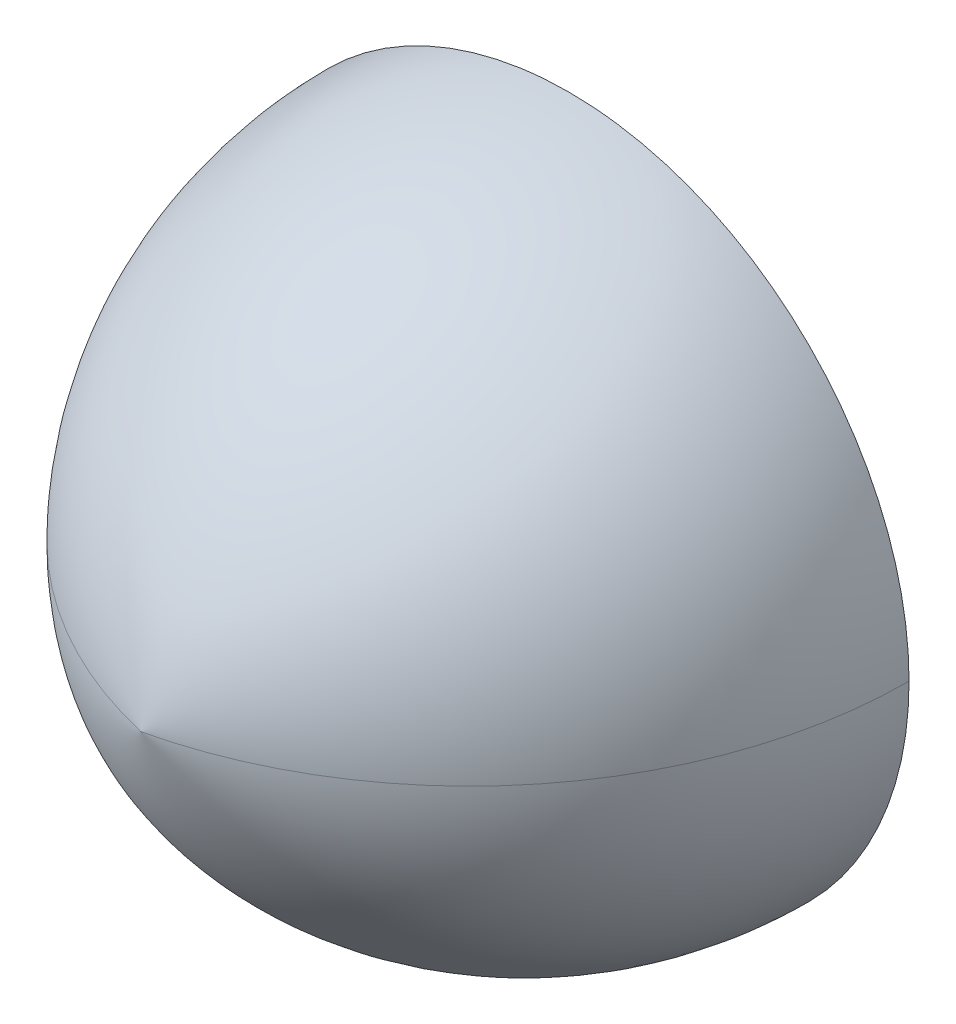
ISO-10303-21;
HEADER;
FILE_DESCRIPTION(('STEP AP214'),'2;1');
FILE_NAME('part.step','',(''),(''),'','','');
FILE_SCHEMA(('AUTOMOTIVE_DESIGN { 1 0 10303 214 1 1 1 1 }'));
ENDSEC;
DATA;
#1=APPLICATION_CONTEXT('core data for automotive mechanical design processes');
#2=APPLICATION_PROTOCOL_DEFINITION('international standard','automotive_design',2000,#1);
#3=PRODUCT_CONTEXT('',#1,'mechanical');
#4=PRODUCT('Part','Part','',(#3));
#5=PRODUCT_RELATED_PRODUCT_CATEGORY('part','',(#4));
#6=PRODUCT_DEFINITION_FORMATION('','',#4);
#7=PRODUCT_DEFINITION_CONTEXT('part definition',#1,'design');
#8=PRODUCT_DEFINITION('design','',#6,#7);
#9=PRODUCT_DEFINITION_SHAPE('','',#8);
#10=(LENGTH_UNIT() NAMED_UNIT(*) SI_UNIT(.MILLI.,.METRE.));
#11=(NAMED_UNIT(*) PLANE_ANGLE_UNIT() SI_UNIT($,.RADIAN.));
#12=(NAMED_UNIT(*) SI_UNIT($,.STERADIAN.) SOLID_ANGLE_UNIT());
#13=UNCERTAINTY_MEASURE_WITH_UNIT(LENGTH_MEASURE(1.E-05),#10,'distance_accuracy_value','');
#14=(GEOMETRIC_REPRESENTATION_CONTEXT(3) GLOBAL_UNCERTAINTY_ASSIGNED_CONTEXT((#13)) GLOBAL_UNIT_ASSIGNED_CONTEXT((#10,
#11,#12)) REPRESENTATION_CONTEXT('',''));
#15=CARTESIAN_POINT('',(0.,0.,0.));
#16=DIRECTION('',(0.,0.,1.));
#17=DIRECTION('',(1.,0.,0.));
#18=AXIS2_PLACEMENT_3D('',#15,#16,#17);
#19=CARTESIAN_POINT('',(0.,0.,3.5));
#20=DIRECTION('',(0.,0.,-1.));
#21=DIRECTION('',(0.,-1.,0.));
#22=AXIS2_PLACEMENT_3D('',#19,#20,#21);
#23=PLANE('',#22);
#24=CARTESIAN_POINT('',(0.,0.,3.5));
#25=DIRECTION('',(0.,0.,1.));
#26=DIRECTION('',(-1.,0.,0.));
#27=AXIS2_PLACEMENT_3D('',#24,#25,#26);
#28=CIRCLE('',#27,5.75);
#29=CARTESIAN_POINT('',(-5.75,0.,3.5));
#30=VERTEX_POINT('',#29);
#31=CARTESIAN_POINT('',(5.75,0.,3.5));
#32=VERTEX_POINT('',#31);
#33=EDGE_CURVE('E11',#30,#32,#28,.T.);
#34=ORIENTED_EDGE('',*,*,#33,.T.);
#35=CARTESIAN_POINT('',(0.,0.,3.5));
#36=DIRECTION('',(0.,0.,1.));
#37=DIRECTION('',(1.,0.,0.));
#38=AXIS2_PLACEMENT_3D('',#35,#36,#37);
#39=CIRCLE('',#38,5.75);
#40=EDGE_CURVE('E136',#32,#30,#39,.T.);
#41=ORIENTED_EDGE('',*,*,#40,.T.);
#42=EDGE_LOOP('',(#34,#41));
#43=FACE_BOUND('',#42,.T.);
#44=CARTESIAN_POINT('',(0.,0.,3.5));
#45=DIRECTION('',(0.,0.,-1.));
#46=DIRECTION('',(-1.,0.,0.));
#47=AXIS2_PLACEMENT_3D('',#44,#45,#46);
#48=CIRCLE('',#47,8.4);
#49=CARTESIAN_POINT('',(-8.4,0.,3.5));
#50=VERTEX_POINT('',#49);
#51=CARTESIAN_POINT('',(8.4,0.,3.5));
#52=VERTEX_POINT('',#51);
#53=EDGE_CURVE('E128',#50,#52,#48,.T.);
#54=ORIENTED_EDGE('',*,*,#53,.T.);
#55=CARTESIAN_POINT('',(0.,0.,3.5));
#56=DIRECTION('',(0.,0.,-1.));
#57=DIRECTION('',(1.,0.,0.));
#58=AXIS2_PLACEMENT_3D('',#55,#56,#57);
#59=CIRCLE('',#58,8.4);
#60=EDGE_CURVE('E152',#52,#50,#59,.T.);
#61=ORIENTED_EDGE('',*,*,#60,.T.);
#62=EDGE_LOOP('',(#54,#61));
#63=FACE_BOUND('',#62,.T.);
#64=ADVANCED_FACE('F16',(#43,#63),#23,.T.);
#65=CARTESIAN_POINT('',(0.,0.,3.5));
#66=DIRECTION('',(0.,0.,-1.));
#67=DIRECTION('',(1.,0.,0.));
#68=AXIS2_PLACEMENT_3D('',#65,#66,#67);
#69=CYLINDRICAL_SURFACE('',#68,5.75);
#70=DIRECTION('',(0.,0.,1.));
#71=VECTOR('',#70,1.);
#72=CARTESIAN_POINT('',(5.75,0.,3.5));
#73=LINE('',#72,#71);
#74=CARTESIAN_POINT('',(5.75,0.,15.70990503957));
#75=VERTEX_POINT('',#74);
#76=EDGE_CURVE('E28',#32,#75,#73,.T.);
#77=ORIENTED_EDGE('',*,*,#76,.F.);
#78=ORIENTED_EDGE('',*,*,#33,.F.);
#79=DIRECTION('',(0.,0.,1.));
#80=VECTOR('',#79,1.);
#81=CARTESIAN_POINT('',(-5.75,0.,3.5));
#82=LINE('',#81,#80);
#83=CARTESIAN_POINT('',(-5.75,0.,15.70990503957));
#84=VERTEX_POINT('',#83);
#85=EDGE_CURVE('E133',#30,#84,#82,.T.);
#86=ORIENTED_EDGE('',*,*,#85,.T.);
#87=CARTESIAN_POINT('',(0.,0.,15.70990503957));
#88=DIRECTION('',(0.,0.,-1.));
#89=DIRECTION('',(1.,0.,0.));
#90=AXIS2_PLACEMENT_3D('',#87,#88,#89);
#91=CIRCLE('',#90,5.75);
#92=EDGE_CURVE('E145',#75,#84,#91,.T.);
#93=ORIENTED_EDGE('',*,*,#92,.F.);
#94=EDGE_LOOP('',(#77,#78,#86,#93));
#95=FACE_BOUND('',#94,.T.);
#96=ADVANCED_FACE('F206',(#95),#69,.F.);
#97=CARTESIAN_POINT('',(0.,0.,3.5));
#98=DIRECTION('',(0.,0.,-1.));
#99=DIRECTION('',(1.,0.,0.));
#100=AXIS2_PLACEMENT_3D('',#97,#98,#99);
#101=CYLINDRICAL_SURFACE('',#100,5.75);
#102=ORIENTED_EDGE('',*,*,#85,.F.);
#103=ORIENTED_EDGE('',*,*,#40,.F.);
#104=ORIENTED_EDGE('',*,*,#76,.T.);
#105=CARTESIAN_POINT('',(0.,0.,15.70990503957));
#106=DIRECTION('',(0.,0.,-1.));
#107=DIRECTION('',(-1.,0.,0.));
#108=AXIS2_PLACEMENT_3D('',#105,#106,#107);
#109=CIRCLE('',#108,5.75);
#110=EDGE_CURVE('E137',#84,#75,#109,.T.);
#111=ORIENTED_EDGE('',*,*,#110,.F.);
#112=EDGE_LOOP('',(#102,#103,#104,#111));
#113=FACE_BOUND('',#112,.T.);
#114=ADVANCED_FACE('F205',(#113),#101,.F.);
#115=CARTESIAN_POINT('',(0.,0.,18.25082749912));
#116=CARTESIAN_POINT('',(-8.878861154744,-0.5586105951421,15.99459569259));
#117=CARTESIAN_POINT('',(-14.40764551764,-0.9064522236506,8.676921688021));
#118=CARTESIAN_POINT('',(-14.16540742833,-0.8912118948655,-0.4979293520499));
#119=CARTESIAN_POINT('',(0.,0.,18.25082749912));
#120=CARTESIAN_POINT('',(-9.22262933143,4.905428105088,15.99459569259));
#121=CARTESIAN_POINT('',(-14.96547494459,7.959992618263,8.676921688021));
#122=CARTESIAN_POINT('',(-14.71385797832,7.826159966674,-0.4979293520499));
#123=CARTESIAN_POINT('',(0.,0.,18.25082749912));
#124=CARTESIAN_POINT('',(-5.47484205040699,8.896416199922,15.99459569259));
#125=CARTESIAN_POINT('',(-8.883975337892,14.43613192637,8.676921688021));
#126=CARTESIAN_POINT('',(-8.734607614436,14.19341489043,-0.4979293520499));
#127=CARTESIAN_POINT('',(0.,0.,18.25082749912));
#128=CARTESIAN_POINT('',(0.,8.89641619992199,15.99459569259));
#129=CARTESIAN_POINT('',(0.,14.43613192637,8.676921688021));
#130=CARTESIAN_POINT('',(0.,14.19341489043,-0.4979293520499));
#131=CARTESIAN_POINT('',(0.,0.,18.25082749912));
#132=CARTESIAN_POINT('',(5.47484205040699,8.896416199922,15.99459569259));
#133=CARTESIAN_POINT('',(8.883975337892,14.43613192637,8.676921688021));
#134=CARTESIAN_POINT('',(8.734607614436,14.19341489043,-0.4979293520499));
#135=CARTESIAN_POINT('',(0.,0.,18.25082749912));
#136=CARTESIAN_POINT('',(9.22262933143,4.905428105088,15.99459569259));
#137=CARTESIAN_POINT('',(14.96547494459,7.959992618263,8.676921688021));
#138=CARTESIAN_POINT('',(14.71385797832,7.826159966674,-0.4979293520499));
#139=CARTESIAN_POINT('',(0.,0.,18.25082749912));
#140=CARTESIAN_POINT('',(8.878861154744,-0.5586105951421,15.99459569259));
#141=CARTESIAN_POINT('',(14.40764551764,-0.9064522236506,8.676921688021));
#142=CARTESIAN_POINT('',(14.16540742833,-0.8912118948655,-0.4979293520499));
#143=(BOUNDED_SURFACE() B_SPLINE_SURFACE(3,3,((#115,#116,#117,#118),(#119,#120,#121,#122),(#123,
#124,#125,#126),(#127,#128,#129,#130),(#131,#132,#133,#134),(#135,#136,#137,#138),(#139,#140,
#141,#142)),.UNSPECIFIED.,.F.,.F.,.F.) B_SPLINE_SURFACE_WITH_KNOTS((4,3,4),(4,4),(0.,1.,2.),(0.,
1.),.UNSPECIFIED.) GEOMETRIC_REPRESENTATION_ITEM() RATIONAL_B_SPLINE_SURFACE(((1.333209242531,
1.138613895815,1.138613895815,1.333209242531),(1.052832766558,0.8991611967054,0.8991611967054,
1.052832766558),(1.052832766558,0.8991611967054,0.8991611967054,1.052832766558),(1.333209242531,
1.138613895815,1.138613895815,1.333209242531),(1.052832766558,0.8991611967054,0.8991611967054,
1.052832766558),(1.052832766558,0.8991611967054,0.8991611967054,1.052832766558),(1.333209242531,
1.138613895815,1.138613895815,1.333209242531))) REPRESENTATION_ITEM('') SURFACE());
#144=CARTESIAN_POINT('',(-4.628616352201,0.,0.));
#145=DIRECTION('',(0.,-1.,0.));
#146=DIRECTION('',(0.551215031315217,0.,0.834363223813325));
#147=AXIS2_PLACEMENT_3D('',#144,#145,#146);
#148=CIRCLE('',#147,18.8286163522);
#149=CARTESIAN_POINT('',(0.,0.,18.25082749912));
#150=VERTEX_POINT('',#149);
#151=EDGE_CURVE('E142',#75,#150,#148,.T.);
#152=CARTESIAN_POINT('',(4.628616352201,0.,0.));
#153=DIRECTION('',(0.,1.,0.));
#154=DIRECTION('',(-0.551215031315217,0.,0.834363223813325));
#155=AXIS2_PLACEMENT_3D('',#152,#153,#154);
#156=CIRCLE('',#155,18.8286163522);
#157=EDGE_CURVE('E127',#84,#150,#156,.T.);
#158=ORIENTED_EDGE('',*,*,#151,.T.);
#159=ORIENTED_EDGE('',*,*,#157,.F.);
#160=ORIENTED_EDGE('',*,*,#110,.T.);
#161=EDGE_LOOP('',(#158,#159,#160));
#162=FACE_BOUND('',#161,.T.);
#163=ADVANCED_FACE('F165',(#162),#143,.F.);
#164=CARTESIAN_POINT('',(0.,0.,18.25082749912));
#165=CARTESIAN_POINT('',(-8.878861154744,-0.5586105951421,15.99459569259));
#166=CARTESIAN_POINT('',(-14.40764551764,-0.9064522236506,8.676921688021));
#167=CARTESIAN_POINT('',(-14.16540742833,-0.8912118948655,-0.4979293520499));
#168=CARTESIAN_POINT('',(0.,0.,18.25082749912));
#169=CARTESIAN_POINT('',(-9.22262933143,4.905428105088,15.99459569259));
#170=CARTESIAN_POINT('',(-14.96547494459,7.959992618263,8.676921688021));
#171=CARTESIAN_POINT('',(-14.71385797832,7.826159966674,-0.4979293520499));
#172=CARTESIAN_POINT('',(0.,0.,18.25082749912));
#173=CARTESIAN_POINT('',(-5.47484205040699,8.896416199922,15.99459569259));
#174=CARTESIAN_POINT('',(-8.883975337892,14.43613192637,8.676921688021));
#175=CARTESIAN_POINT('',(-8.734607614436,14.19341489043,-0.4979293520499));
#176=CARTESIAN_POINT('',(0.,0.,18.25082749912));
#177=CARTESIAN_POINT('',(0.,8.89641619992199,15.99459569259));
#178=CARTESIAN_POINT('',(0.,14.43613192637,8.676921688021));
#179=CARTESIAN_POINT('',(0.,14.19341489043,-0.4979293520499));
#180=CARTESIAN_POINT('',(0.,0.,18.25082749912));
#181=CARTESIAN_POINT('',(5.47484205040699,8.896416199922,15.99459569259));
#182=CARTESIAN_POINT('',(8.883975337892,14.43613192637,8.676921688021));
#183=CARTESIAN_POINT('',(8.734607614436,14.19341489043,-0.4979293520499));
#184=CARTESIAN_POINT('',(0.,0.,18.25082749912));
#185=CARTESIAN_POINT('',(9.22262933143,4.905428105088,15.99459569259));
#186=CARTESIAN_POINT('',(14.96547494459,7.959992618263,8.676921688021));
#187=CARTESIAN_POINT('',(14.71385797832,7.826159966674,-0.4979293520499));
#188=CARTESIAN_POINT('',(0.,0.,18.25082749912));
#189=CARTESIAN_POINT('',(8.878861154744,-0.5586105951421,15.99459569259));
#190=CARTESIAN_POINT('',(14.40764551764,-0.9064522236506,8.676921688021));
#191=CARTESIAN_POINT('',(14.16540742833,-0.8912118948655,-0.4979293520499));
#192=(BOUNDED_SURFACE() B_SPLINE_SURFACE(3,3,((#164,#165,#166,#167),(#168,#169,#170,#171),(#172,
#173,#174,#175),(#176,#177,#178,#179),(#180,#181,#182,#183),(#184,#185,#186,#187),(#188,#189,
#190,#191)),.UNSPECIFIED.,.F.,.F.,.F.) B_SPLINE_SURFACE_WITH_KNOTS((4,3,4),(4,4),(0.,1.,2.),(0.,
1.),.UNSPECIFIED.) GEOMETRIC_REPRESENTATION_ITEM() RATIONAL_B_SPLINE_SURFACE(((1.333209242531,
1.138613895815,1.138613895815,1.333209242531),(1.052832766558,0.8991611967054,0.8991611967054,
1.052832766558),(1.052832766558,0.8991611967054,0.8991611967054,1.052832766558),(1.333209242531,
1.138613895815,1.138613895815,1.333209242531),(1.052832766558,0.8991611967054,0.8991611967054,
1.052832766558),(1.052832766558,0.8991611967054,0.8991611967054,1.052832766558),(1.333209242531,
1.138613895815,1.138613895815,1.333209242531))) REPRESENTATION_ITEM('') SURFACE());
#193=CARTESIAN_POINT('',(4.628616352201,0.,0.));
#194=DIRECTION('',(0.,1.,0.));
#195=DIRECTION('',(-1.,0.,0.));
#196=AXIS2_PLACEMENT_3D('',#193,#194,#195);
#197=CIRCLE('',#196,18.8286163522);
#198=CARTESIAN_POINT('',(-14.2,0.,0.));
#199=VERTEX_POINT('',#198);
#200=CARTESIAN_POINT('',(-8.4,0.,13.59308462732));
#201=VERTEX_POINT('',#200);
#202=EDGE_CURVE('E63',#199,#201,#197,.T.);
#203=CARTESIAN_POINT('',(0.,0.,0.));
#204=DIRECTION('',(0.,0.,-1.));
#205=DIRECTION('',(-1.,0.,0.));
#206=AXIS2_PLACEMENT_3D('',#203,#204,#205);
#207=CIRCLE('',#206,14.2);
#208=CARTESIAN_POINT('',(14.2,0.,0.));
#209=VERTEX_POINT('',#208);
#210=EDGE_CURVE('E109',#199,#209,#207,.T.);
#211=CARTESIAN_POINT('',(-4.628616352201,0.,0.));
#212=DIRECTION('',(0.,-1.,0.));
#213=DIRECTION('',(1.,0.,0.));
#214=AXIS2_PLACEMENT_3D('',#211,#212,#213);
#215=CIRCLE('',#214,18.8286163522);
#216=CARTESIAN_POINT('',(8.4,0.,13.59308462732));
#217=VERTEX_POINT('',#216);
#218=EDGE_CURVE('E141',#209,#217,#215,.T.);
#219=CARTESIAN_POINT('',(0.,0.,13.59308462732));
#220=DIRECTION('',(0.,0.,-1.));
#221=DIRECTION('',(-1.,0.,0.));
#222=AXIS2_PLACEMENT_3D('',#219,#220,#221);
#223=CIRCLE('',#222,8.4);
#224=EDGE_CURVE('E131',#201,#217,#223,.T.);
#225=ORIENTED_EDGE('',*,*,#202,.F.);
#226=ORIENTED_EDGE('',*,*,#210,.T.);
#227=ORIENTED_EDGE('',*,*,#218,.T.);
#228=ORIENTED_EDGE('',*,*,#224,.F.);
#229=EDGE_LOOP('',(#225,#226,#227,#228));
#230=FACE_BOUND('',#229,.T.);
#231=ADVANCED_FACE('F187',(#230),#192,.F.);
#232=CARTESIAN_POINT('',(0.,0.,3.5));
#233=DIRECTION('',(0.,0.,-1.));
#234=DIRECTION('',(1.,0.,0.));
#235=AXIS2_PLACEMENT_3D('',#232,#233,#234);
#236=CYLINDRICAL_SURFACE('',#235,8.4);
#237=DIRECTION('',(0.,0.,1.));
#238=VECTOR('',#237,1.);
#239=CARTESIAN_POINT('',(8.4,0.,3.5));
#240=LINE('',#239,#238);
#241=EDGE_CURVE('E132',#52,#217,#240,.T.);
#242=ORIENTED_EDGE('',*,*,#241,.F.);
#243=ORIENTED_EDGE('',*,*,#53,.F.);
#244=DIRECTION('',(0.,0.,1.));
#245=VECTOR('',#244,1.);
#246=CARTESIAN_POINT('',(-8.4,0.,3.5));
#247=LINE('',#246,#245);
#248=EDGE_CURVE('E149',#50,#201,#247,.T.);
#249=ORIENTED_EDGE('',*,*,#248,.T.);
#250=ORIENTED_EDGE('',*,*,#224,.T.);
#251=EDGE_LOOP('',(#242,#243,#249,#250));
#252=FACE_BOUND('',#251,.T.);
#253=ADVANCED_FACE('F229',(#252),#236,.T.);
#254=CARTESIAN_POINT('',(0.,0.,3.5));
#255=DIRECTION('',(0.,0.,-1.));
#256=DIRECTION('',(1.,0.,0.));
#257=AXIS2_PLACEMENT_3D('',#254,#255,#256);
#258=CYLINDRICAL_SURFACE('',#257,8.4);
#259=ORIENTED_EDGE('',*,*,#248,.F.);
#260=ORIENTED_EDGE('',*,*,#60,.F.);
#261=ORIENTED_EDGE('',*,*,#241,.T.);
#262=CARTESIAN_POINT('',(0.,0.,13.59308462732));
#263=DIRECTION('',(0.,0.,-1.));
#264=DIRECTION('',(1.,0.,0.));
#265=AXIS2_PLACEMENT_3D('',#262,#263,#264);
#266=CIRCLE('',#265,8.4);
#267=EDGE_CURVE('E124',#217,#201,#266,.T.);
#268=ORIENTED_EDGE('',*,*,#267,.T.);
#269=EDGE_LOOP('',(#259,#260,#261,#268));
#270=FACE_BOUND('',#269,.T.);
#271=ADVANCED_FACE('F237',(#270),#258,.T.);
#272=CARTESIAN_POINT('',(0.,0.,18.25082749912));
#273=CARTESIAN_POINT('',(8.878861154744,0.5586105951421,15.99459569259));
#274=CARTESIAN_POINT('',(14.40764551764,0.9064522236506,8.676921688021));
#275=CARTESIAN_POINT('',(14.16540742833,0.8912118948655,-0.4979293520499));
#276=CARTESIAN_POINT('',(0.,0.,18.25082749912));
#277=CARTESIAN_POINT('',(9.22262933143,-4.905428105088,15.99459569259));
#278=CARTESIAN_POINT('',(14.96547494459,-7.959992618263,8.676921688021));
#279=CARTESIAN_POINT('',(14.71385797832,-7.826159966674,-0.4979293520499));
#280=CARTESIAN_POINT('',(0.,0.,18.25082749912));
#281=CARTESIAN_POINT('',(5.47484205040699,-8.896416199922,15.99459569259));
#282=CARTESIAN_POINT('',(8.883975337892,-14.43613192637,8.676921688021));
#283=CARTESIAN_POINT('',(8.734607614436,-14.19341489043,-0.4979293520499));
#284=CARTESIAN_POINT('',(0.,0.,18.25082749912));
#285=CARTESIAN_POINT('',(0.,-8.89641619992199,15.99459569259));
#286=CARTESIAN_POINT('',(0.,-14.43613192637,8.676921688021));
#287=CARTESIAN_POINT('',(0.,-14.19341489043,-0.4979293520499));
#288=CARTESIAN_POINT('',(0.,0.,18.25082749912));
#289=CARTESIAN_POINT('',(-5.47484205040699,-8.896416199922,15.99459569259));
#290=CARTESIAN_POINT('',(-8.883975337892,-14.43613192637,8.676921688021));
#291=CARTESIAN_POINT('',(-8.734607614436,-14.19341489043,-0.4979293520499));
#292=CARTESIAN_POINT('',(0.,0.,18.25082749912));
#293=CARTESIAN_POINT('',(-9.22262933143,-4.905428105087,15.99459569259));
#294=CARTESIAN_POINT('',(-14.96547494459,-7.959992618263,8.676921688021));
#295=CARTESIAN_POINT('',(-14.71385797832,-7.826159966674,-0.4979293520499));
#296=CARTESIAN_POINT('',(0.,0.,18.25082749912));
#297=CARTESIAN_POINT('',(-8.878861154744,0.5586105951421,15.99459569259));
#298=CARTESIAN_POINT('',(-14.40764551764,0.9064522236506,8.676921688021));
#299=CARTESIAN_POINT('',(-14.16540742833,0.8912118948655,-0.4979293520499));
#300=(BOUNDED_SURFACE() B_SPLINE_SURFACE(3,3,((#272,#273,#274,#275),(#276,#277,#278,#279),(#280,
#281,#282,#283),(#284,#285,#286,#287),(#288,#289,#290,#291),(#292,#293,#294,#295),(#296,#297,
#298,#299)),.UNSPECIFIED.,.F.,.F.,.F.) B_SPLINE_SURFACE_WITH_KNOTS((4,3,4),(4,4),(0.,1.,2.),(0.,
1.),.UNSPECIFIED.) GEOMETRIC_REPRESENTATION_ITEM() RATIONAL_B_SPLINE_SURFACE(((1.333209242531,
1.138613895815,1.138613895815,1.333209242531),(1.052832766558,0.8991611967054,0.8991611967054,
1.052832766558),(1.052832766558,0.8991611967054,0.8991611967054,1.052832766558),(1.333209242531,
1.138613895815,1.138613895815,1.333209242531),(1.052832766558,0.8991611967054,0.8991611967054,
1.052832766558),(1.052832766558,0.8991611967054,0.8991611967054,1.052832766558),(1.333209242531,
1.138613895815,1.138613895815,1.333209242531))) REPRESENTATION_ITEM('') SURFACE());
#301=ORIENTED_EDGE('',*,*,#157,.T.);
#302=ORIENTED_EDGE('',*,*,#151,.F.);
#303=ORIENTED_EDGE('',*,*,#92,.T.);
#304=EDGE_LOOP('',(#301,#302,#303));
#305=FACE_BOUND('',#304,.T.);
#306=ADVANCED_FACE('F162',(#305),#300,.F.);
#307=CARTESIAN_POINT('',(0.,0.,18.25082749912));
#308=CARTESIAN_POINT('',(8.878861154744,0.5586105951421,15.99459569259));
#309=CARTESIAN_POINT('',(14.40764551764,0.9064522236506,8.676921688021));
#310=CARTESIAN_POINT('',(14.16540742833,0.8912118948655,-0.4979293520499));
#311=CARTESIAN_POINT('',(0.,0.,18.25082749912));
#312=CARTESIAN_POINT('',(9.22262933143,-4.905428105088,15.99459569259));
#313=CARTESIAN_POINT('',(14.96547494459,-7.959992618263,8.676921688021));
#314=CARTESIAN_POINT('',(14.71385797832,-7.826159966674,-0.4979293520499));
#315=CARTESIAN_POINT('',(0.,0.,18.25082749912));
#316=CARTESIAN_POINT('',(5.47484205040699,-8.896416199922,15.99459569259));
#317=CARTESIAN_POINT('',(8.883975337892,-14.43613192637,8.676921688021));
#318=CARTESIAN_POINT('',(8.734607614436,-14.19341489043,-0.4979293520499));
#319=CARTESIAN_POINT('',(0.,0.,18.25082749912));
#320=CARTESIAN_POINT('',(0.,-8.89641619992199,15.99459569259));
#321=CARTESIAN_POINT('',(0.,-14.43613192637,8.676921688021));
#322=CARTESIAN_POINT('',(0.,-14.19341489043,-0.4979293520499));
#323=CARTESIAN_POINT('',(0.,0.,18.25082749912));
#324=CARTESIAN_POINT('',(-5.47484205040699,-8.896416199922,15.99459569259));
#325=CARTESIAN_POINT('',(-8.883975337892,-14.43613192637,8.676921688021));
#326=CARTESIAN_POINT('',(-8.734607614436,-14.19341489043,-0.4979293520499));
#327=CARTESIAN_POINT('',(0.,0.,18.25082749912));
#328=CARTESIAN_POINT('',(-9.22262933143,-4.905428105087,15.99459569259));
#329=CARTESIAN_POINT('',(-14.96547494459,-7.959992618263,8.676921688021));
#330=CARTESIAN_POINT('',(-14.71385797832,-7.826159966674,-0.4979293520499));
#331=CARTESIAN_POINT('',(0.,0.,18.25082749912));
#332=CARTESIAN_POINT('',(-8.878861154744,0.5586105951421,15.99459569259));
#333=CARTESIAN_POINT('',(-14.40764551764,0.9064522236506,8.676921688021));
#334=CARTESIAN_POINT('',(-14.16540742833,0.8912118948655,-0.4979293520499));
#335=(BOUNDED_SURFACE() B_SPLINE_SURFACE(3,3,((#307,#308,#309,#310),(#311,#312,#313,#314),(#315,
#316,#317,#318),(#319,#320,#321,#322),(#323,#324,#325,#326),(#327,#328,#329,#330),(#331,#332,
#333,#334)),.UNSPECIFIED.,.F.,.F.,.F.) B_SPLINE_SURFACE_WITH_KNOTS((4,3,4),(4,4),(0.,1.,2.),(0.,
1.),.UNSPECIFIED.) GEOMETRIC_REPRESENTATION_ITEM() RATIONAL_B_SPLINE_SURFACE(((1.333209242531,
1.138613895815,1.138613895815,1.333209242531),(1.052832766558,0.8991611967054,0.8991611967054,
1.052832766558),(1.052832766558,0.8991611967054,0.8991611967054,1.052832766558),(1.333209242531,
1.138613895815,1.138613895815,1.333209242531),(1.052832766558,0.8991611967054,0.8991611967054,
1.052832766558),(1.052832766558,0.8991611967054,0.8991611967054,1.052832766558),(1.333209242531,
1.138613895815,1.138613895815,1.333209242531))) REPRESENTATION_ITEM('') SURFACE());
#336=CARTESIAN_POINT('',(0.,0.,0.));
#337=DIRECTION('',(0.,0.,-1.));
#338=DIRECTION('',(1.,0.,0.));
#339=AXIS2_PLACEMENT_3D('',#336,#337,#338);
#340=CIRCLE('',#339,14.2);
#341=EDGE_CURVE('E138',#209,#199,#340,.T.);
#342=ORIENTED_EDGE('',*,*,#218,.F.);
#343=ORIENTED_EDGE('',*,*,#341,.T.);
#344=ORIENTED_EDGE('',*,*,#202,.T.);
#345=ORIENTED_EDGE('',*,*,#267,.F.);
#346=EDGE_LOOP('',(#342,#343,#344,#345));
#347=FACE_BOUND('',#346,.T.);
#348=ADVANCED_FACE('F191',(#347),#335,.F.);
#349=CARTESIAN_POINT('',(0.,0.,0.));
#350=DIRECTION('',(0.,0.,-1.));
#351=DIRECTION('',(0.,-1.,0.));
#352=AXIS2_PLACEMENT_3D('',#349,#350,#351);
#353=PLANE('',#352);
#354=ORIENTED_EDGE('',*,*,#210,.F.);
#355=ORIENTED_EDGE('',*,*,#341,.F.);
#356=EDGE_LOOP('',(#354,#355));
#357=FACE_BOUND('',#356,.T.);
#358=CARTESIAN_POINT('',(0.,0.,0.));
#359=DIRECTION('',(0.,0.,-1.));
#360=DIRECTION('',(1.,0.,0.));
#361=AXIS2_PLACEMENT_3D('',#358,#359,#360);
#362=CIRCLE('',#361,15.9);
#363=CARTESIAN_POINT('',(15.9,0.,0.));
#364=VERTEX_POINT('',#363);
#365=CARTESIAN_POINT('',(-15.9,0.,0.));
#366=VERTEX_POINT('',#365);
#367=EDGE_CURVE('E111',#364,#366,#362,.T.);
#368=ORIENTED_EDGE('',*,*,#367,.T.);
#369=CARTESIAN_POINT('',(0.,0.,0.));
#370=DIRECTION('',(0.,0.,1.));
#371=DIRECTION('',(1.,0.,0.));
#372=AXIS2_PLACEMENT_3D('',#369,#370,#371);
#373=CIRCLE('',#372,15.9);
#374=EDGE_CURVE('E76',#364,#366,#373,.T.);
#375=ORIENTED_EDGE('',*,*,#374,.F.);
#376=EDGE_LOOP('',(#368,#375));
#377=FACE_BOUND('',#376,.T.);
#378=ADVANCED_FACE('F112',(#357,#377),#353,.T.);
#379=CARTESIAN_POINT('',(0.,0.,20.));
#380=CARTESIAN_POINT('',(-9.911233199977,-0.6235619388499,17.70170002701));
#381=CARTESIAN_POINT('',(-16.134524996,-1.015098271419,9.638146571879));
#382=CARTESIAN_POINT('',(-15.86123068916,-0.997904051042099,-0.5514839603054));
#383=CARTESIAN_POINT('',(0.,0.,20.));
#384=CARTESIAN_POINT('',(-10.29497234247,5.475797069905,17.70170002701));
#385=CARTESIAN_POINT('',(-16.75921504835,8.914065779179,9.638146571879));
#386=CARTESIAN_POINT('',(-16.47533944241,8.763075066482,-0.5514839603054));
#387=CARTESIAN_POINT('',(0.,0.,20.));
#388=CARTESIAN_POINT('',(-6.111418497139,9.930829423362,17.70170002701));
#389=CARTESIAN_POINT('',(-9.948795726378,16.16642574433,9.638146571879));
#390=CARTESIAN_POINT('',(-9.78027826258399,15.89259108736,-0.5514839603054));
#391=CARTESIAN_POINT('',(0.,0.,20.));
#392=CARTESIAN_POINT('',(0.,9.93082942336199,17.70170002701));
#393=CARTESIAN_POINT('',(0.,16.16642574433,9.638146571879));
#394=CARTESIAN_POINT('',(0.,15.89259108736,-0.5514839603054));
#395=CARTESIAN_POINT('',(0.,0.,20.));
#396=CARTESIAN_POINT('',(6.111418497139,9.930829423362,17.70170002701));
#397=CARTESIAN_POINT('',(9.948795726378,16.16642574433,9.638146571879));
#398=CARTESIAN_POINT('',(9.78027826258399,15.89259108736,-0.5514839603054));
#399=CARTESIAN_POINT('',(0.,0.,20.));
#400=CARTESIAN_POINT('',(10.29497234247,5.475797069905,17.70170002701));
#401=CARTESIAN_POINT('',(16.75921504835,8.914065779179,9.638146571879));
#402=CARTESIAN_POINT('',(16.47533944241,8.763075066482,-0.5514839603054));
#403=CARTESIAN_POINT('',(0.,0.,20.));
#404=CARTESIAN_POINT('',(9.911233199977,-0.6235619388499,17.70170002701));
#405=CARTESIAN_POINT('',(16.134524996,-1.015098271419,9.638146571879));
#406=CARTESIAN_POINT('',(15.86123068916,-0.997904051042099,-0.5514839603054));
#407=(BOUNDED_SURFACE() B_SPLINE_SURFACE(3,3,((#379,#380,#381,#382),(#383,#384,#385,#386),(#387,
#388,#389,#390),(#391,#392,#393,#394),(#395,#396,#397,#398),(#399,#400,#401,#402),(#403,#404,
#405,#406)),.UNSPECIFIED.,.F.,.F.,.F.) B_SPLINE_SURFACE_WITH_KNOTS((4,3,4),(4,4),(0.,1.,2.),(0.,
1.),.UNSPECIFIED.) GEOMETRIC_REPRESENTATION_ITEM() RATIONAL_B_SPLINE_SURFACE(((1.338255319363,
1.136931870204,1.136931870204,1.338255319363),(1.056817643697,0.8978329043258,0.8978329043258,
1.056817643697),(1.056817643697,0.8978329043258,0.8978329043258,1.056817643697),(1.338255319363,
1.136931870204,1.136931870204,1.338255319363),(1.056817643697,0.8978329043258,0.8978329043258,
1.056817643697),(1.056817643697,0.8978329043258,0.8978329043258,1.056817643697),(1.338255319363,
1.136931870204,1.136931870204,1.338255319363))) REPRESENTATION_ITEM('') SURFACE());
#408=CARTESIAN_POINT('',(4.628616352201,0.,0.));
#409=DIRECTION('',(0.,1.,0.));
#410=DIRECTION('',(-1.,0.,0.));
#411=AXIS2_PLACEMENT_3D('',#408,#409,#410);
#412=CIRCLE('',#411,20.5286163522);
#413=CARTESIAN_POINT('',(0.,0.,20.));
#414=VERTEX_POINT('',#413);
#415=EDGE_CURVE('E106',#366,#414,#412,.T.);
#416=CARTESIAN_POINT('',(-4.628616352201,0.,0.));
#417=DIRECTION('',(0.,-1.,0.));
#418=DIRECTION('',(1.,0.,0.));
#419=AXIS2_PLACEMENT_3D('',#416,#417,#418);
#420=CIRCLE('',#419,20.5286163522);
#421=EDGE_CURVE('E22',#364,#414,#420,.T.);
#422=ORIENTED_EDGE('',*,*,#374,.T.);
#423=ORIENTED_EDGE('',*,*,#415,.T.);
#424=ORIENTED_EDGE('',*,*,#421,.F.);
#425=EDGE_LOOP('',(#422,#423,#424));
#426=FACE_BOUND('',#425,.T.);
#427=ADVANCED_FACE('F104',(#426),#407,.T.);
#428=CARTESIAN_POINT('',(0.,0.,20.));
#429=CARTESIAN_POINT('',(9.911233199977,0.6235619388499,17.70170002701));
#430=CARTESIAN_POINT('',(16.134524996,1.015098271419,9.638146571879));
#431=CARTESIAN_POINT('',(15.86123068916,0.997904051042099,-0.5514839603054));
#432=CARTESIAN_POINT('',(0.,0.,20.));
#433=CARTESIAN_POINT('',(10.29497234247,-5.475797069905,17.70170002701));
#434=CARTESIAN_POINT('',(16.75921504835,-8.914065779179,9.638146571879));
#435=CARTESIAN_POINT('',(16.47533944241,-8.763075066482,-0.5514839603054));
#436=CARTESIAN_POINT('',(0.,0.,20.));
#437=CARTESIAN_POINT('',(6.111418497139,-9.930829423362,17.70170002701));
#438=CARTESIAN_POINT('',(9.948795726378,-16.16642574433,9.638146571879));
#439=CARTESIAN_POINT('',(9.78027826258399,-15.89259108736,-0.5514839603054));
#440=CARTESIAN_POINT('',(0.,0.,20.));
#441=CARTESIAN_POINT('',(0.,-9.93082942336199,17.70170002701));
#442=CARTESIAN_POINT('',(0.,-16.16642574433,9.638146571879));
#443=CARTESIAN_POINT('',(0.,-15.89259108736,-0.5514839603054));
#444=CARTESIAN_POINT('',(0.,0.,20.));
#445=CARTESIAN_POINT('',(-6.111418497139,-9.930829423362,17.70170002701));
#446=CARTESIAN_POINT('',(-9.948795726378,-16.16642574433,9.638146571879));
#447=CARTESIAN_POINT('',(-9.78027826258399,-15.89259108736,-0.5514839603054));
#448=CARTESIAN_POINT('',(0.,0.,20.));
#449=CARTESIAN_POINT('',(-10.29497234247,-5.475797069905,17.70170002701));
#450=CARTESIAN_POINT('',(-16.75921504835,-8.914065779179,9.638146571879));
#451=CARTESIAN_POINT('',(-16.47533944241,-8.763075066482,-0.5514839603054));
#452=CARTESIAN_POINT('',(0.,0.,20.));
#453=CARTESIAN_POINT('',(-9.911233199977,0.6235619388499,17.70170002701));
#454=CARTESIAN_POINT('',(-16.134524996,1.015098271419,9.638146571879));
#455=CARTESIAN_POINT('',(-15.86123068916,0.997904051042099,-0.5514839603054));
#456=(BOUNDED_SURFACE() B_SPLINE_SURFACE(3,3,((#428,#429,#430,#431),(#432,#433,#434,#435),(#436,
#437,#438,#439),(#440,#441,#442,#443),(#444,#445,#446,#447),(#448,#449,#450,#451),(#452,#453,
#454,#455)),.UNSPECIFIED.,.F.,.F.,.F.) B_SPLINE_SURFACE_WITH_KNOTS((4,3,4),(4,4),(0.,1.,2.),(0.,
1.),.UNSPECIFIED.) GEOMETRIC_REPRESENTATION_ITEM() RATIONAL_B_SPLINE_SURFACE(((1.338255319363,
1.136931870204,1.136931870204,1.338255319363),(1.056817643697,0.8978329043258,0.8978329043258,
1.056817643697),(1.056817643697,0.8978329043258,0.8978329043258,1.056817643697),(1.338255319363,
1.136931870204,1.136931870204,1.338255319363),(1.056817643697,0.8978329043258,0.8978329043258,
1.056817643697),(1.056817643697,0.8978329043258,0.8978329043258,1.056817643697),(1.338255319363,
1.136931870204,1.136931870204,1.338255319363))) REPRESENTATION_ITEM('') SURFACE());
#457=ORIENTED_EDGE('',*,*,#415,.F.);
#458=ORIENTED_EDGE('',*,*,#367,.F.);
#459=ORIENTED_EDGE('',*,*,#421,.T.);
#460=EDGE_LOOP('',(#457,#458,#459));
#461=FACE_BOUND('',#460,.T.);
#462=ADVANCED_FACE('F18',(#461),#456,.T.);
#463=CLOSED_SHELL('',(#64,#96,#114,#163,#231,#253,#271,#306,#348,#378,#427,#462));
#464=MANIFOLD_SOLID_BREP('B1',#463);
#465=ADVANCED_BREP_SHAPE_REPRESENTATION('',(#18,#464),#14);
#466=SHAPE_DEFINITION_REPRESENTATION(#9,#465);
ENDSEC;
END-ISO-10303-21;
